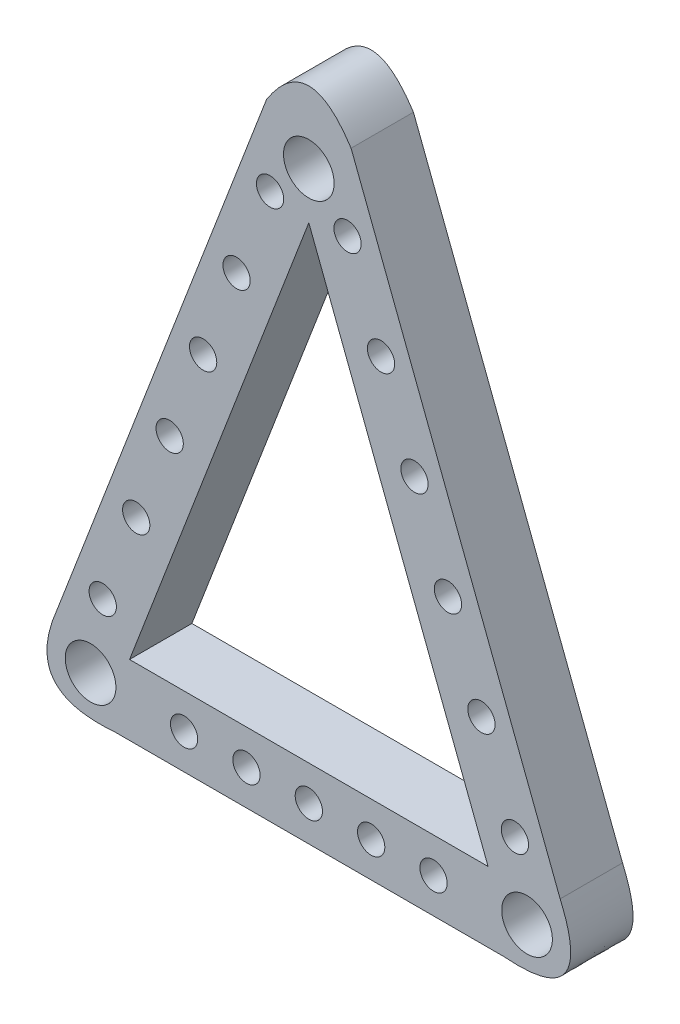
ISO-10303-21;
HEADER;
FILE_DESCRIPTION(('STEP AP214'),'2;1');
FILE_NAME('part.step','',(''),(''),'','','');
FILE_SCHEMA(('AUTOMOTIVE_DESIGN { 1 0 10303 214 1 1 1 1 }'));
ENDSEC;
DATA;
#1=APPLICATION_CONTEXT('core data for automotive mechanical design processes');
#2=APPLICATION_PROTOCOL_DEFINITION('international standard','automotive_design',2000,#1);
#3=PRODUCT_CONTEXT('',#1,'mechanical');
#4=PRODUCT('Part','Part','',(#3));
#5=PRODUCT_RELATED_PRODUCT_CATEGORY('part','',(#4));
#6=PRODUCT_DEFINITION_FORMATION('','',#4);
#7=PRODUCT_DEFINITION_CONTEXT('part definition',#1,'design');
#8=PRODUCT_DEFINITION('design','',#6,#7);
#9=PRODUCT_DEFINITION_SHAPE('','',#8);
#10=(LENGTH_UNIT() NAMED_UNIT(*) SI_UNIT(.MILLI.,.METRE.));
#11=(NAMED_UNIT(*) PLANE_ANGLE_UNIT() SI_UNIT($,.RADIAN.));
#12=(NAMED_UNIT(*) SI_UNIT($,.STERADIAN.) SOLID_ANGLE_UNIT());
#13=UNCERTAINTY_MEASURE_WITH_UNIT(LENGTH_MEASURE(1.E-05),#10,'distance_accuracy_value','');
#14=(GEOMETRIC_REPRESENTATION_CONTEXT(3) GLOBAL_UNCERTAINTY_ASSIGNED_CONTEXT((#13)) GLOBAL_UNIT_ASSIGNED_CONTEXT((#10,
#11,#12)) REPRESENTATION_CONTEXT('',''));
#15=CARTESIAN_POINT('',(0.,0.,0.));
#16=DIRECTION('',(0.,0.,1.));
#17=DIRECTION('',(1.,0.,0.));
#18=AXIS2_PLACEMENT_3D('',#15,#16,#17);
#19=CARTESIAN_POINT('',(0.,39.2060961403509,8.));
#20=DIRECTION('',(0.,0.,1.));
#21=DIRECTION('',(1.,0.,0.));
#22=AXIS2_PLACEMENT_3D('',#19,#20,#21);
#23=PLANE('',#22);
#24=CARTESIAN_POINT('',(9.26509593674221,13.7944872057478,8.));
#25=DIRECTION('',(0.,0.,1.));
#26=DIRECTION('',(-1.,0.,0.));
#27=AXIS2_PLACEMENT_3D('',#24,#25,#26);
#28=CIRCLE('',#27,1.75);
#29=CARTESIAN_POINT('',(7.5150959367422,13.7944872057478,8.));
#30=VERTEX_POINT('',#29);
#31=EDGE_CURVE('E361',#30,#30,#28,.T.);
#32=ORIENTED_EDGE('',*,*,#31,.F.);
#33=EDGE_LOOP('',(#32));
#34=FACE_BOUND('',#33,.T.);
#35=CARTESIAN_POINT('',(17.8526411081752,-8.61653838275659,8.));
#36=DIRECTION('',(0.,0.,1.));
#37=DIRECTION('',(-1.,0.,0.));
#38=AXIS2_PLACEMENT_3D('',#35,#36,#37);
#39=CIRCLE('',#38,1.75);
#40=CARTESIAN_POINT('',(16.1026411081751,-8.61653838275659,8.));
#41=VERTEX_POINT('',#40);
#42=EDGE_CURVE('E376',#41,#41,#39,.T.);
#43=ORIENTED_EDGE('',*,*,#42,.F.);
#44=EDGE_LOOP('',(#43));
#45=FACE_BOUND('',#44,.T.);
#46=CARTESIAN_POINT('',(26.4401862796081,-31.027563971261,8.));
#47=DIRECTION('',(0.,0.,1.));
#48=DIRECTION('',(-1.,0.,0.));
#49=AXIS2_PLACEMENT_3D('',#46,#47,#48);
#50=CIRCLE('',#49,1.75);
#51=CARTESIAN_POINT('',(24.6901862796081,-31.027563971261,8.));
#52=VERTEX_POINT('',#51);
#53=EDGE_CURVE('E390',#52,#52,#50,.T.);
#54=ORIENTED_EDGE('',*,*,#53,.F.);
#55=EDGE_LOOP('',(#54));
#56=FACE_BOUND('',#55,.T.);
#57=CARTESIAN_POINT('',(8.,-40.5233918128655,8.));
#58=DIRECTION('',(0.,0.,1.));
#59=DIRECTION('',(-1.,0.,0.));
#60=AXIS2_PLACEMENT_3D('',#57,#58,#59);
#61=CIRCLE('',#60,1.75);
#62=CARTESIAN_POINT('',(6.25,-40.5233918128655,8.));
#63=VERTEX_POINT('',#62);
#64=EDGE_CURVE('E404',#63,#63,#61,.T.);
#65=ORIENTED_EDGE('',*,*,#64,.F.);
#66=EDGE_LOOP('',(#65));
#67=FACE_BOUND('',#66,.T.);
#68=CARTESIAN_POINT('',(-8.,-40.5233918128655,8.));
#69=DIRECTION('',(0.,0.,1.));
#70=DIRECTION('',(1.,0.,0.));
#71=AXIS2_PLACEMENT_3D('',#68,#69,#70);
#72=CIRCLE('',#71,1.75);
#73=CARTESIAN_POINT('',(-6.25,-40.5233918128655,8.));
#74=VERTEX_POINT('',#73);
#75=EDGE_CURVE('E418',#74,#74,#72,.T.);
#76=ORIENTED_EDGE('',*,*,#75,.F.);
#77=EDGE_LOOP('',(#76));
#78=FACE_BOUND('',#77,.T.);
#79=CARTESIAN_POINT('',(-26.4401862796081,-31.027563971261,8.));
#80=DIRECTION('',(0.,0.,1.));
#81=DIRECTION('',(1.,0.,0.));
#82=AXIS2_PLACEMENT_3D('',#79,#80,#81);
#83=CIRCLE('',#82,1.75);
#84=CARTESIAN_POINT('',(-24.6901862796081,-31.027563971261,8.));
#85=VERTEX_POINT('',#84);
#86=EDGE_CURVE('E432',#85,#85,#83,.T.);
#87=ORIENTED_EDGE('',*,*,#86,.F.);
#88=EDGE_LOOP('',(#87));
#89=FACE_BOUND('',#88,.T.);
#90=CARTESIAN_POINT('',(-17.8526411081752,-8.61653838275659,8.));
#91=DIRECTION('',(0.,0.,1.));
#92=DIRECTION('',(1.,0.,0.));
#93=AXIS2_PLACEMENT_3D('',#90,#91,#92);
#94=CIRCLE('',#93,1.75);
#95=CARTESIAN_POINT('',(-16.1026411081751,-8.61653838275659,8.));
#96=VERTEX_POINT('',#95);
#97=EDGE_CURVE('E446',#96,#96,#94,.T.);
#98=ORIENTED_EDGE('',*,*,#97,.F.);
#99=EDGE_LOOP('',(#98));
#100=FACE_BOUND('',#99,.T.);
#101=CARTESIAN_POINT('',(-4.97132335102573,25.,8.));
#102=DIRECTION('',(0.,0.,1.));
#103=DIRECTION('',(1.,0.,0.));
#104=AXIS2_PLACEMENT_3D('',#101,#102,#103);
#105=CIRCLE('',#104,1.75);
#106=CARTESIAN_POINT('',(-3.22132335102573,25.,8.));
#107=VERTEX_POINT('',#106);
#108=EDGE_CURVE('E460',#107,#107,#105,.T.);
#109=ORIENTED_EDGE('',*,*,#108,.F.);
#110=EDGE_LOOP('',(#109));
#111=FACE_BOUND('',#110,.T.);
#112=DIRECTION('',(-0.357814382143039,-0.93379273285435,0.));
#113=VECTOR('',#112,1.);
#114=CARTESIAN_POINT('',(0.,24.,8.));
#115=LINE('',#114,#113);
#116=CARTESIAN_POINT('',(0.,24.,8.));
#117=VERTEX_POINT('',#116);
#118=CARTESIAN_POINT('',(-23.,-36.0233918128655,8.));
#119=VERTEX_POINT('',#118);
#120=EDGE_CURVE('E121',#117,#119,#115,.T.);
#121=ORIENTED_EDGE('',*,*,#120,.F.);
#122=DIRECTION('',(-0.35781438214304,0.93379273285435,0.));
#123=VECTOR('',#122,1.);
#124=CARTESIAN_POINT('',(23.,-36.0233918128655,8.));
#125=LINE('',#124,#123);
#126=CARTESIAN_POINT('',(23.,-36.0233918128655,8.));
#127=VERTEX_POINT('',#126);
#128=EDGE_CURVE('E112',#127,#117,#125,.T.);
#129=ORIENTED_EDGE('',*,*,#128,.F.);
#130=DIRECTION('',(1.,0.,0.));
#131=VECTOR('',#130,1.);
#132=CARTESIAN_POINT('',(-23.,-36.0233918128655,8.));
#133=LINE('',#132,#131);
#134=EDGE_CURVE('E132',#119,#127,#133,.T.);
#135=ORIENTED_EDGE('',*,*,#134,.F.);
#136=EDGE_LOOP('',(#121,#129,#135));
#137=FACE_BOUND('',#136,.T.);
#138=CARTESIAN_POINT('',(28.,-40.,8.));
#139=DIRECTION('',(0.,0.,1.));
#140=DIRECTION('',(1.,0.,0.));
#141=AXIS2_PLACEMENT_3D('',#138,#139,#140);
#142=CIRCLE('',#141,3.25);
#143=CARTESIAN_POINT('',(31.25,-40.,8.));
#144=VERTEX_POINT('',#143);
#145=EDGE_CURVE('E151',#144,#144,#142,.T.);
#146=ORIENTED_EDGE('',*,*,#145,.F.);
#147=EDGE_LOOP('',(#146));
#148=FACE_BOUND('',#147,.T.);
#149=CARTESIAN_POINT('',(0.,30.,8.));
#150=DIRECTION('',(0.,0.,1.));
#151=DIRECTION('',(1.,0.,0.));
#152=AXIS2_PLACEMENT_3D('',#149,#150,#151);
#153=CIRCLE('',#152,3.25);
#154=CARTESIAN_POINT('',(3.25,30.,8.));
#155=VERTEX_POINT('',#154);
#156=EDGE_CURVE('E167',#155,#155,#153,.T.);
#157=ORIENTED_EDGE('',*,*,#156,.F.);
#158=EDGE_LOOP('',(#157));
#159=FACE_BOUND('',#158,.T.);
#160=CARTESIAN_POINT('',(5.42308974813626,35.,8.));
#161=CARTESIAN_POINT('',(0.,43.4121922807018,8.));
#162=CARTESIAN_POINT('',(-5.42308974813626,35.,8.));
#163=B_SPLINE_CURVE_WITH_KNOTS('',2,(#160,#161,#162),.UNSPECIFIED.,.F.,.F.,(3,3),(0.,1.),.UNSPECIFIED.);
#164=CARTESIAN_POINT('',(5.42308974813626,35.,8.));
#165=VERTEX_POINT('',#164);
#166=CARTESIAN_POINT('',(-5.42308974813626,35.,8.));
#167=VERTEX_POINT('',#166);
#168=EDGE_CURVE('E174',#165,#167,#163,.T.);
#169=ORIENTED_EDGE('',*,*,#168,.T.);
#170=DIRECTION('',(-0.35781438214304,-0.93379273285435,0.));
#171=VECTOR('',#170,1.);
#172=CARTESIAN_POINT('',(-5.42308974813626,35.,8.));
#173=LINE('',#172,#171);
#174=CARTESIAN_POINT('',(-32.2459658198432,-35.,8.));
#175=VERTEX_POINT('',#174);
#176=EDGE_CURVE('E181',#167,#175,#173,.T.);
#177=ORIENTED_EDGE('',*,*,#176,.T.);
#178=CARTESIAN_POINT('',(-32.2459658198432,-35.,8.));
#179=CARTESIAN_POINT('',(-37.,-46.,8.));
#180=CARTESIAN_POINT('',(-25.,-45.0233918128655,8.));
#181=B_SPLINE_CURVE_WITH_KNOTS('',2,(#178,#179,#180),.UNSPECIFIED.,.F.,.F.,(3,3),(0.,1.),.UNSPECIFIED.);
#182=CARTESIAN_POINT('',(-25.,-45.0233918128655,8.));
#183=VERTEX_POINT('',#182);
#184=EDGE_CURVE('E188',#175,#183,#181,.T.);
#185=ORIENTED_EDGE('',*,*,#184,.T.);
#186=DIRECTION('',(1.,0.,0.));
#187=VECTOR('',#186,1.);
#188=CARTESIAN_POINT('',(-25.,-45.0233918128655,8.));
#189=LINE('',#188,#187);
#190=CARTESIAN_POINT('',(25.,-45.0233918128655,8.));
#191=VERTEX_POINT('',#190);
#192=EDGE_CURVE('E194',#183,#191,#189,.T.);
#193=ORIENTED_EDGE('',*,*,#192,.T.);
#194=CARTESIAN_POINT('',(25.,-45.0233918128655,8.));
#195=CARTESIAN_POINT('',(37.,-46.,8.));
#196=CARTESIAN_POINT('',(32.2459658198432,-35.,8.));
#197=B_SPLINE_CURVE_WITH_KNOTS('',2,(#194,#195,#196),.UNSPECIFIED.,.F.,.F.,(3,3),(0.,1.),.UNSPECIFIED.);
#198=CARTESIAN_POINT('',(32.2459658198432,-35.,8.));
#199=VERTEX_POINT('',#198);
#200=EDGE_CURVE('E234',#191,#199,#197,.T.);
#201=ORIENTED_EDGE('',*,*,#200,.T.);
#202=DIRECTION('',(-0.357814382143039,0.93379273285435,0.));
#203=VECTOR('',#202,1.);
#204=CARTESIAN_POINT('',(5.42308974813626,35.,8.));
#205=LINE('',#204,#203);
#206=EDGE_CURVE('E240',#199,#165,#205,.T.);
#207=ORIENTED_EDGE('',*,*,#206,.T.);
#208=EDGE_LOOP('',(#169,#177,#185,#193,#201,#207));
#209=FACE_BOUND('',#208,.T.);
#210=CARTESIAN_POINT('',(-28.,-40.,8.));
#211=DIRECTION('',(0.,0.,1.));
#212=DIRECTION('',(1.,0.,0.));
#213=AXIS2_PLACEMENT_3D('',#210,#211,#212);
#214=CIRCLE('',#213,3.25);
#215=CARTESIAN_POINT('',(-24.75,-40.,8.));
#216=VERTEX_POINT('',#215);
#217=EDGE_CURVE('E159',#216,#216,#214,.T.);
#218=ORIENTED_EDGE('',*,*,#217,.F.);
#219=EDGE_LOOP('',(#218));
#220=FACE_BOUND('',#219,.T.);
#221=CARTESIAN_POINT('',(-9.26509593674221,13.7944872057478,8.));
#222=DIRECTION('',(0.,0.,1.));
#223=DIRECTION('',(1.,0.,0.));
#224=AXIS2_PLACEMENT_3D('',#221,#222,#223);
#225=CIRCLE('',#224,1.75);
#226=CARTESIAN_POINT('',(-7.5150959367422,13.7944872057478,8.));
#227=VERTEX_POINT('',#226);
#228=EDGE_CURVE('E141',#227,#227,#225,.T.);
#229=ORIENTED_EDGE('',*,*,#228,.F.);
#230=EDGE_LOOP('',(#229));
#231=FACE_BOUND('',#230,.T.);
#232=CARTESIAN_POINT('',(-13.5588685224587,2.58897441149561,8.));
#233=DIRECTION('',(0.,0.,1.));
#234=DIRECTION('',(1.,0.,0.));
#235=AXIS2_PLACEMENT_3D('',#232,#233,#234);
#236=CIRCLE('',#235,1.75);
#237=CARTESIAN_POINT('',(-11.8088685224587,2.58897441149561,8.));
#238=VERTEX_POINT('',#237);
#239=EDGE_CURVE('E325',#238,#238,#236,.T.);
#240=ORIENTED_EDGE('',*,*,#239,.F.);
#241=EDGE_LOOP('',(#240));
#242=FACE_BOUND('',#241,.T.);
#243=CARTESIAN_POINT('',(-22.1464136938916,-19.8220511770088,8.));
#244=DIRECTION('',(0.,0.,1.));
#245=DIRECTION('',(1.,0.,0.));
#246=AXIS2_PLACEMENT_3D('',#243,#244,#245);
#247=CIRCLE('',#246,1.75);
#248=CARTESIAN_POINT('',(-20.3964136938916,-19.8220511770088,8.));
#249=VERTEX_POINT('',#248);
#250=EDGE_CURVE('E329',#249,#249,#247,.T.);
#251=ORIENTED_EDGE('',*,*,#250,.F.);
#252=EDGE_LOOP('',(#251));
#253=FACE_BOUND('',#252,.T.);
#254=CARTESIAN_POINT('',(-16.,-40.5233918128655,8.));
#255=DIRECTION('',(0.,0.,1.));
#256=DIRECTION('',(1.,0.,0.));
#257=AXIS2_PLACEMENT_3D('',#254,#255,#256);
#258=CIRCLE('',#257,1.75);
#259=CARTESIAN_POINT('',(-14.25,-40.5233918128655,8.));
#260=VERTEX_POINT('',#259);
#261=EDGE_CURVE('E333',#260,#260,#258,.T.);
#262=ORIENTED_EDGE('',*,*,#261,.F.);
#263=EDGE_LOOP('',(#262));
#264=FACE_BOUND('',#263,.T.);
#265=CARTESIAN_POINT('',(0.,-40.5233918128655,8.));
#266=DIRECTION('',(0.,0.,1.));
#267=DIRECTION('',(1.,0.,0.));
#268=AXIS2_PLACEMENT_3D('',#265,#266,#267);
#269=CIRCLE('',#268,1.75);
#270=CARTESIAN_POINT('',(1.75,-40.5233918128655,8.));
#271=VERTEX_POINT('',#270);
#272=EDGE_CURVE('E337',#271,#271,#269,.T.);
#273=ORIENTED_EDGE('',*,*,#272,.F.);
#274=EDGE_LOOP('',(#273));
#275=FACE_BOUND('',#274,.T.);
#276=CARTESIAN_POINT('',(16.,-40.5233918128655,8.));
#277=DIRECTION('',(0.,0.,1.));
#278=DIRECTION('',(-1.,0.,0.));
#279=AXIS2_PLACEMENT_3D('',#276,#277,#278);
#280=CIRCLE('',#279,1.75);
#281=CARTESIAN_POINT('',(14.25,-40.5233918128655,8.));
#282=VERTEX_POINT('',#281);
#283=EDGE_CURVE('E341',#282,#282,#280,.T.);
#284=ORIENTED_EDGE('',*,*,#283,.F.);
#285=EDGE_LOOP('',(#284));
#286=FACE_BOUND('',#285,.T.);
#287=CARTESIAN_POINT('',(22.1464136938916,-19.8220511770088,8.));
#288=DIRECTION('',(0.,0.,1.));
#289=DIRECTION('',(-1.,0.,0.));
#290=AXIS2_PLACEMENT_3D('',#287,#288,#289);
#291=CIRCLE('',#290,1.75);
#292=CARTESIAN_POINT('',(20.3964136938916,-19.8220511770088,8.));
#293=VERTEX_POINT('',#292);
#294=EDGE_CURVE('E345',#293,#293,#291,.T.);
#295=ORIENTED_EDGE('',*,*,#294,.F.);
#296=EDGE_LOOP('',(#295));
#297=FACE_BOUND('',#296,.T.);
#298=CARTESIAN_POINT('',(13.5588685224587,2.58897441149561,8.));
#299=DIRECTION('',(0.,0.,1.));
#300=DIRECTION('',(-1.,0.,0.));
#301=AXIS2_PLACEMENT_3D('',#298,#299,#300);
#302=CIRCLE('',#301,1.75);
#303=CARTESIAN_POINT('',(11.8088685224587,2.58897441149561,8.));
#304=VERTEX_POINT('',#303);
#305=EDGE_CURVE('E349',#304,#304,#302,.T.);
#306=ORIENTED_EDGE('',*,*,#305,.F.);
#307=EDGE_LOOP('',(#306));
#308=FACE_BOUND('',#307,.T.);
#309=CARTESIAN_POINT('',(4.97132335102573,25.,8.));
#310=DIRECTION('',(0.,0.,1.));
#311=DIRECTION('',(-1.,0.,0.));
#312=AXIS2_PLACEMENT_3D('',#309,#310,#311);
#313=CIRCLE('',#312,1.75);
#314=CARTESIAN_POINT('',(3.22132335102573,25.,8.));
#315=VERTEX_POINT('',#314);
#316=EDGE_CURVE('E352',#315,#315,#313,.T.);
#317=ORIENTED_EDGE('',*,*,#316,.F.);
#318=EDGE_LOOP('',(#317));
#319=FACE_BOUND('',#318,.T.);
#320=ADVANCED_FACE('F39',(#34,#45,#56,#67,#78,#89,#100,#111,#137,#148,#159,#209,#220,#231,#242,
#253,#264,#275,#286,#297,#308,#319),#23,.T.);
#321=CARTESIAN_POINT('',(0.,39.2060961403509,0.));
#322=DIRECTION('',(0.,0.,1.));
#323=DIRECTION('',(1.,0.,0.));
#324=AXIS2_PLACEMENT_3D('',#321,#322,#323);
#325=PLANE('',#324);
#326=CARTESIAN_POINT('',(28.,-40.,0.));
#327=DIRECTION('',(0.,0.,1.));
#328=DIRECTION('',(1.,0.,0.));
#329=AXIS2_PLACEMENT_3D('',#326,#327,#328);
#330=CIRCLE('',#329,3.25);
#331=CARTESIAN_POINT('',(31.25,-40.,0.));
#332=VERTEX_POINT('',#331);
#333=EDGE_CURVE('E129',#332,#332,#330,.T.);
#334=ORIENTED_EDGE('',*,*,#333,.T.);
#335=EDGE_LOOP('',(#334));
#336=FACE_BOUND('',#335,.T.);
#337=CARTESIAN_POINT('',(-28.,-40.,0.));
#338=DIRECTION('',(0.,0.,1.));
#339=DIRECTION('',(1.,0.,0.));
#340=AXIS2_PLACEMENT_3D('',#337,#338,#339);
#341=CIRCLE('',#340,3.25);
#342=CARTESIAN_POINT('',(-24.75,-40.,0.));
#343=VERTEX_POINT('',#342);
#344=EDGE_CURVE('E155',#343,#343,#341,.T.);
#345=ORIENTED_EDGE('',*,*,#344,.T.);
#346=EDGE_LOOP('',(#345));
#347=FACE_BOUND('',#346,.T.);
#348=CARTESIAN_POINT('',(0.,30.,0.));
#349=DIRECTION('',(0.,0.,1.));
#350=DIRECTION('',(1.,0.,0.));
#351=AXIS2_PLACEMENT_3D('',#348,#349,#350);
#352=CIRCLE('',#351,3.25);
#353=CARTESIAN_POINT('',(3.25,30.,0.));
#354=VERTEX_POINT('',#353);
#355=EDGE_CURVE('E163',#354,#354,#352,.T.);
#356=ORIENTED_EDGE('',*,*,#355,.T.);
#357=EDGE_LOOP('',(#356));
#358=FACE_BOUND('',#357,.T.);
#359=CARTESIAN_POINT('',(5.42308974813626,35.,0.));
#360=CARTESIAN_POINT('',(0.,43.4121922807018,0.));
#361=CARTESIAN_POINT('',(-5.42308974813626,35.,0.));
#362=B_SPLINE_CURVE_WITH_KNOTS('',2,(#359,#360,#361),.UNSPECIFIED.,.F.,.F.,(3,3),(0.,1.),.UNSPECIFIED.);
#363=CARTESIAN_POINT('',(5.42308974813626,35.,0.));
#364=VERTEX_POINT('',#363);
#365=CARTESIAN_POINT('',(-5.42308974813626,35.,0.));
#366=VERTEX_POINT('',#365);
#367=EDGE_CURVE('E171',#364,#366,#362,.T.);
#368=ORIENTED_EDGE('',*,*,#367,.F.);
#369=DIRECTION('',(-0.357814382143039,0.93379273285435,0.));
#370=VECTOR('',#369,1.);
#371=CARTESIAN_POINT('',(5.42308974813626,35.,0.));
#372=LINE('',#371,#370);
#373=CARTESIAN_POINT('',(32.2459658198432,-35.,0.));
#374=VERTEX_POINT('',#373);
#375=EDGE_CURVE('E182',#374,#364,#372,.T.);
#376=ORIENTED_EDGE('',*,*,#375,.F.);
#377=CARTESIAN_POINT('',(25.,-45.0233918128655,0.));
#378=CARTESIAN_POINT('',(37.,-46.,0.));
#379=CARTESIAN_POINT('',(32.2459658198432,-35.,0.));
#380=B_SPLINE_CURVE_WITH_KNOTS('',2,(#377,#378,#379),.UNSPECIFIED.,.F.,.F.,(3,3),(0.,1.),.UNSPECIFIED.);
#381=CARTESIAN_POINT('',(25.,-45.0233918128655,0.));
#382=VERTEX_POINT('',#381);
#383=EDGE_CURVE('E269',#382,#374,#380,.T.);
#384=ORIENTED_EDGE('',*,*,#383,.F.);
#385=DIRECTION('',(1.,0.,0.));
#386=VECTOR('',#385,1.);
#387=CARTESIAN_POINT('',(-25.,-45.0233918128655,0.));
#388=LINE('',#387,#386);
#389=CARTESIAN_POINT('',(-25.,-45.0233918128655,0.));
#390=VERTEX_POINT('',#389);
#391=EDGE_CURVE('E263',#390,#382,#388,.T.);
#392=ORIENTED_EDGE('',*,*,#391,.F.);
#393=CARTESIAN_POINT('',(-32.2459658198432,-35.,0.));
#394=CARTESIAN_POINT('',(-37.,-46.,0.));
#395=CARTESIAN_POINT('',(-25.,-45.0233918128655,0.));
#396=B_SPLINE_CURVE_WITH_KNOTS('',2,(#393,#394,#395),.UNSPECIFIED.,.F.,.F.,(3,3),(0.,1.),.UNSPECIFIED.);
#397=CARTESIAN_POINT('',(-32.2459658198432,-35.,0.));
#398=VERTEX_POINT('',#397);
#399=EDGE_CURVE('E258',#398,#390,#396,.T.);
#400=ORIENTED_EDGE('',*,*,#399,.F.);
#401=DIRECTION('',(-0.35781438214304,-0.93379273285435,0.));
#402=VECTOR('',#401,1.);
#403=CARTESIAN_POINT('',(-5.42308974813626,35.,0.));
#404=LINE('',#403,#402);
#405=EDGE_CURVE('E252',#366,#398,#404,.T.);
#406=ORIENTED_EDGE('',*,*,#405,.F.);
#407=EDGE_LOOP('',(#368,#376,#384,#392,#400,#406));
#408=FACE_BOUND('',#407,.T.);
#409=DIRECTION('',(-0.35781438214304,0.93379273285435,0.));
#410=VECTOR('',#409,1.);
#411=CARTESIAN_POINT('',(23.,-36.0233918128655,0.));
#412=LINE('',#411,#410);
#413=CARTESIAN_POINT('',(23.,-36.0233918128655,0.));
#414=VERTEX_POINT('',#413);
#415=CARTESIAN_POINT('',(0.,24.,0.));
#416=VERTEX_POINT('',#415);
#417=EDGE_CURVE('E64',#414,#416,#412,.T.);
#418=ORIENTED_EDGE('',*,*,#417,.T.);
#419=DIRECTION('',(-0.357814382143039,-0.93379273285435,0.));
#420=VECTOR('',#419,1.);
#421=CARTESIAN_POINT('',(0.,24.,0.));
#422=LINE('',#421,#420);
#423=CARTESIAN_POINT('',(-23.,-36.0233918128655,0.));
#424=VERTEX_POINT('',#423);
#425=EDGE_CURVE('E127',#416,#424,#422,.T.);
#426=ORIENTED_EDGE('',*,*,#425,.T.);
#427=DIRECTION('',(1.,0.,0.));
#428=VECTOR('',#427,1.);
#429=CARTESIAN_POINT('',(-23.,-36.0233918128655,0.));
#430=LINE('',#429,#428);
#431=EDGE_CURVE('E122',#424,#414,#430,.T.);
#432=ORIENTED_EDGE('',*,*,#431,.T.);
#433=EDGE_LOOP('',(#418,#426,#432));
#434=FACE_BOUND('',#433,.T.);
#435=CARTESIAN_POINT('',(-9.26509593674221,13.7944872057478,0.));
#436=DIRECTION('',(0.,0.,1.));
#437=DIRECTION('',(1.,0.,0.));
#438=AXIS2_PLACEMENT_3D('',#435,#436,#437);
#439=CIRCLE('',#438,1.75);
#440=CARTESIAN_POINT('',(-7.5150959367422,13.7944872057478,0.));
#441=VERTEX_POINT('',#440);
#442=EDGE_CURVE('E464',#441,#441,#439,.T.);
#443=ORIENTED_EDGE('',*,*,#442,.T.);
#444=EDGE_LOOP('',(#443));
#445=FACE_BOUND('',#444,.T.);
#446=CARTESIAN_POINT('',(-4.97132335102573,25.,0.));
#447=DIRECTION('',(0.,0.,1.));
#448=DIRECTION('',(1.,0.,0.));
#449=AXIS2_PLACEMENT_3D('',#446,#447,#448);
#450=CIRCLE('',#449,1.75);
#451=CARTESIAN_POINT('',(-3.22132335102573,25.,0.));
#452=VERTEX_POINT('',#451);
#453=EDGE_CURVE('E456',#452,#452,#450,.T.);
#454=ORIENTED_EDGE('',*,*,#453,.T.);
#455=EDGE_LOOP('',(#454));
#456=FACE_BOUND('',#455,.T.);
#457=CARTESIAN_POINT('',(-13.5588685224587,2.58897441149561,0.));
#458=DIRECTION('',(0.,0.,1.));
#459=DIRECTION('',(1.,0.,0.));
#460=AXIS2_PLACEMENT_3D('',#457,#458,#459);
#461=CIRCLE('',#460,1.75);
#462=CARTESIAN_POINT('',(-11.8088685224587,2.58897441149561,0.));
#463=VERTEX_POINT('',#462);
#464=EDGE_CURVE('E450',#463,#463,#461,.T.);
#465=ORIENTED_EDGE('',*,*,#464,.T.);
#466=EDGE_LOOP('',(#465));
#467=FACE_BOUND('',#466,.T.);
#468=CARTESIAN_POINT('',(-17.8526411081752,-8.61653838275659,0.));
#469=DIRECTION('',(0.,0.,1.));
#470=DIRECTION('',(1.,0.,0.));
#471=AXIS2_PLACEMENT_3D('',#468,#469,#470);
#472=CIRCLE('',#471,1.75);
#473=CARTESIAN_POINT('',(-16.1026411081751,-8.61653838275659,0.));
#474=VERTEX_POINT('',#473);
#475=EDGE_CURVE('E442',#474,#474,#472,.T.);
#476=ORIENTED_EDGE('',*,*,#475,.T.);
#477=EDGE_LOOP('',(#476));
#478=FACE_BOUND('',#477,.T.);
#479=CARTESIAN_POINT('',(-22.1464136938916,-19.8220511770088,0.));
#480=DIRECTION('',(0.,0.,1.));
#481=DIRECTION('',(1.,0.,0.));
#482=AXIS2_PLACEMENT_3D('',#479,#480,#481);
#483=CIRCLE('',#482,1.75);
#484=CARTESIAN_POINT('',(-20.3964136938916,-19.8220511770088,0.));
#485=VERTEX_POINT('',#484);
#486=EDGE_CURVE('E436',#485,#485,#483,.T.);
#487=ORIENTED_EDGE('',*,*,#486,.T.);
#488=EDGE_LOOP('',(#487));
#489=FACE_BOUND('',#488,.T.);
#490=CARTESIAN_POINT('',(-26.4401862796081,-31.027563971261,0.));
#491=DIRECTION('',(0.,0.,1.));
#492=DIRECTION('',(1.,0.,0.));
#493=AXIS2_PLACEMENT_3D('',#490,#491,#492);
#494=CIRCLE('',#493,1.75);
#495=CARTESIAN_POINT('',(-24.6901862796081,-31.027563971261,0.));
#496=VERTEX_POINT('',#495);
#497=EDGE_CURVE('E428',#496,#496,#494,.T.);
#498=ORIENTED_EDGE('',*,*,#497,.T.);
#499=EDGE_LOOP('',(#498));
#500=FACE_BOUND('',#499,.T.);
#501=CARTESIAN_POINT('',(-16.,-40.5233918128655,0.));
#502=DIRECTION('',(0.,0.,1.));
#503=DIRECTION('',(1.,0.,0.));
#504=AXIS2_PLACEMENT_3D('',#501,#502,#503);
#505=CIRCLE('',#504,1.75);
#506=CARTESIAN_POINT('',(-14.25,-40.5233918128655,0.));
#507=VERTEX_POINT('',#506);
#508=EDGE_CURVE('E422',#507,#507,#505,.T.);
#509=ORIENTED_EDGE('',*,*,#508,.T.);
#510=EDGE_LOOP('',(#509));
#511=FACE_BOUND('',#510,.T.);
#512=CARTESIAN_POINT('',(-8.,-40.5233918128655,0.));
#513=DIRECTION('',(0.,0.,1.));
#514=DIRECTION('',(1.,0.,0.));
#515=AXIS2_PLACEMENT_3D('',#512,#513,#514);
#516=CIRCLE('',#515,1.75);
#517=CARTESIAN_POINT('',(-6.25,-40.5233918128655,0.));
#518=VERTEX_POINT('',#517);
#519=EDGE_CURVE('E414',#518,#518,#516,.T.);
#520=ORIENTED_EDGE('',*,*,#519,.T.);
#521=EDGE_LOOP('',(#520));
#522=FACE_BOUND('',#521,.T.);
#523=CARTESIAN_POINT('',(0.,-40.5233918128655,0.));
#524=DIRECTION('',(0.,0.,1.));
#525=DIRECTION('',(1.,0.,0.));
#526=AXIS2_PLACEMENT_3D('',#523,#524,#525);
#527=CIRCLE('',#526,1.75);
#528=CARTESIAN_POINT('',(1.75,-40.5233918128655,0.));
#529=VERTEX_POINT('',#528);
#530=EDGE_CURVE('E408',#529,#529,#527,.T.);
#531=ORIENTED_EDGE('',*,*,#530,.T.);
#532=EDGE_LOOP('',(#531));
#533=FACE_BOUND('',#532,.T.);
#534=CARTESIAN_POINT('',(8.,-40.5233918128655,0.));
#535=DIRECTION('',(0.,0.,1.));
#536=DIRECTION('',(-1.,0.,0.));
#537=AXIS2_PLACEMENT_3D('',#534,#535,#536);
#538=CIRCLE('',#537,1.75);
#539=CARTESIAN_POINT('',(6.25,-40.5233918128655,0.));
#540=VERTEX_POINT('',#539);
#541=EDGE_CURVE('E400',#540,#540,#538,.T.);
#542=ORIENTED_EDGE('',*,*,#541,.T.);
#543=EDGE_LOOP('',(#542));
#544=FACE_BOUND('',#543,.T.);
#545=CARTESIAN_POINT('',(16.,-40.5233918128655,0.));
#546=DIRECTION('',(0.,0.,1.));
#547=DIRECTION('',(-1.,0.,0.));
#548=AXIS2_PLACEMENT_3D('',#545,#546,#547);
#549=CIRCLE('',#548,1.75);
#550=CARTESIAN_POINT('',(14.25,-40.5233918128655,0.));
#551=VERTEX_POINT('',#550);
#552=EDGE_CURVE('E394',#551,#551,#549,.T.);
#553=ORIENTED_EDGE('',*,*,#552,.T.);
#554=EDGE_LOOP('',(#553));
#555=FACE_BOUND('',#554,.T.);
#556=CARTESIAN_POINT('',(26.4401862796081,-31.027563971261,0.));
#557=DIRECTION('',(0.,0.,1.));
#558=DIRECTION('',(-1.,0.,0.));
#559=AXIS2_PLACEMENT_3D('',#556,#557,#558);
#560=CIRCLE('',#559,1.75);
#561=CARTESIAN_POINT('',(24.6901862796081,-31.027563971261,0.));
#562=VERTEX_POINT('',#561);
#563=EDGE_CURVE('E386',#562,#562,#560,.T.);
#564=ORIENTED_EDGE('',*,*,#563,.T.);
#565=EDGE_LOOP('',(#564));
#566=FACE_BOUND('',#565,.T.);
#567=CARTESIAN_POINT('',(22.1464136938916,-19.8220511770088,0.));
#568=DIRECTION('',(0.,0.,1.));
#569=DIRECTION('',(-1.,0.,0.));
#570=AXIS2_PLACEMENT_3D('',#567,#568,#569);
#571=CIRCLE('',#570,1.75);
#572=CARTESIAN_POINT('',(20.3964136938916,-19.8220511770088,0.));
#573=VERTEX_POINT('',#572);
#574=EDGE_CURVE('E380',#573,#573,#571,.T.);
#575=ORIENTED_EDGE('',*,*,#574,.T.);
#576=EDGE_LOOP('',(#575));
#577=FACE_BOUND('',#576,.T.);
#578=CARTESIAN_POINT('',(17.8526411081752,-8.61653838275659,0.));
#579=DIRECTION('',(0.,0.,1.));
#580=DIRECTION('',(-1.,0.,0.));
#581=AXIS2_PLACEMENT_3D('',#578,#579,#580);
#582=CIRCLE('',#581,1.75);
#583=CARTESIAN_POINT('',(16.1026411081751,-8.61653838275659,0.));
#584=VERTEX_POINT('',#583);
#585=EDGE_CURVE('E372',#584,#584,#582,.T.);
#586=ORIENTED_EDGE('',*,*,#585,.T.);
#587=EDGE_LOOP('',(#586));
#588=FACE_BOUND('',#587,.T.);
#589=CARTESIAN_POINT('',(13.5588685224587,2.58897441149561,0.));
#590=DIRECTION('',(0.,0.,1.));
#591=DIRECTION('',(-1.,0.,0.));
#592=AXIS2_PLACEMENT_3D('',#589,#590,#591);
#593=CIRCLE('',#592,1.75);
#594=CARTESIAN_POINT('',(11.8088685224587,2.58897441149561,0.));
#595=VERTEX_POINT('',#594);
#596=EDGE_CURVE('E368',#595,#595,#593,.T.);
#597=ORIENTED_EDGE('',*,*,#596,.T.);
#598=EDGE_LOOP('',(#597));
#599=FACE_BOUND('',#598,.T.);
#600=CARTESIAN_POINT('',(9.26509593674221,13.7944872057478,0.));
#601=DIRECTION('',(0.,0.,1.));
#602=DIRECTION('',(-1.,0.,0.));
#603=AXIS2_PLACEMENT_3D('',#600,#601,#602);
#604=CIRCLE('',#603,1.75);
#605=CARTESIAN_POINT('',(7.5150959367422,13.7944872057478,0.));
#606=VERTEX_POINT('',#605);
#607=EDGE_CURVE('E355',#606,#606,#604,.T.);
#608=ORIENTED_EDGE('',*,*,#607,.T.);
#609=EDGE_LOOP('',(#608));
#610=FACE_BOUND('',#609,.T.);
#611=CARTESIAN_POINT('',(4.97132335102573,25.,0.));
#612=DIRECTION('',(0.,0.,1.));
#613=DIRECTION('',(-1.,0.,0.));
#614=AXIS2_PLACEMENT_3D('',#611,#612,#613);
#615=CIRCLE('',#614,1.75);
#616=CARTESIAN_POINT('',(3.22132335102573,25.,0.));
#617=VERTEX_POINT('',#616);
#618=EDGE_CURVE('E356',#617,#617,#615,.T.);
#619=ORIENTED_EDGE('',*,*,#618,.T.);
#620=EDGE_LOOP('',(#619));
#621=FACE_BOUND('',#620,.T.);
#622=ADVANCED_FACE('F212',(#336,#347,#358,#408,#434,#445,#456,#467,#478,#489,#500,#511,#522,
#533,#544,#555,#566,#577,#588,#599,#610,#621),#325,.F.);
#623=DIRECTION('',(0.,0.,-1.));
#624=VECTOR('',#623,1.);
#625=SURFACE_OF_LINEAR_EXTRUSION('',#163,#624);
#626=ORIENTED_EDGE('',*,*,#367,.T.);
#627=DIRECTION('',(0.,0.,-1.));
#628=VECTOR('',#627,1.);
#629=CARTESIAN_POINT('',(-5.42308974813626,35.,8.));
#630=LINE('',#629,#628);
#631=EDGE_CURVE('E11',#167,#366,#630,.T.);
#632=ORIENTED_EDGE('',*,*,#631,.F.);
#633=ORIENTED_EDGE('',*,*,#168,.F.);
#634=DIRECTION('',(0.,0.,-1.));
#635=VECTOR('',#634,1.);
#636=CARTESIAN_POINT('',(5.42308974813626,35.,8.));
#637=LINE('',#636,#635);
#638=EDGE_CURVE('E246',#165,#364,#637,.T.);
#639=ORIENTED_EDGE('',*,*,#638,.T.);
#640=EDGE_LOOP('',(#626,#632,#633,#639));
#641=FACE_BOUND('',#640,.T.);
#642=ADVANCED_FACE('F41',(#641),#625,.F.);
#643=CARTESIAN_POINT('',(-5.42308974813626,35.,8.));
#644=DIRECTION('',(0.93379273285435,-0.35781438214304,0.));
#645=DIRECTION('',(0.35781438214304,0.93379273285435,0.));
#646=AXIS2_PLACEMENT_3D('',#643,#644,#645);
#647=PLANE('',#646);
#648=ORIENTED_EDGE('',*,*,#405,.T.);
#649=DIRECTION('',(0.,0.,-1.));
#650=VECTOR('',#649,1.);
#651=CARTESIAN_POINT('',(-32.2459658198432,-35.,8.));
#652=LINE('',#651,#650);
#653=EDGE_CURVE('E49',#175,#398,#652,.T.);
#654=ORIENTED_EDGE('',*,*,#653,.F.);
#655=ORIENTED_EDGE('',*,*,#176,.F.);
#656=ORIENTED_EDGE('',*,*,#631,.T.);
#657=EDGE_LOOP('',(#648,#654,#655,#656));
#658=FACE_BOUND('',#657,.T.);
#659=ADVANCED_FACE('F204',(#658),#647,.F.);
#660=DIRECTION('',(0.,0.,-1.));
#661=VECTOR('',#660,1.);
#662=SURFACE_OF_LINEAR_EXTRUSION('',#181,#661);
#663=ORIENTED_EDGE('',*,*,#399,.T.);
#664=DIRECTION('',(0.,0.,-1.));
#665=VECTOR('',#664,1.);
#666=CARTESIAN_POINT('',(-25.,-45.0233918128655,8.));
#667=LINE('',#666,#665);
#668=EDGE_CURVE('E290',#183,#390,#667,.T.);
#669=ORIENTED_EDGE('',*,*,#668,.F.);
#670=ORIENTED_EDGE('',*,*,#184,.F.);
#671=ORIENTED_EDGE('',*,*,#653,.T.);
#672=EDGE_LOOP('',(#663,#669,#670,#671));
#673=FACE_BOUND('',#672,.T.);
#674=ADVANCED_FACE('F200',(#673),#662,.F.);
#675=CARTESIAN_POINT('',(-25.,-45.0233918128655,8.));
#676=DIRECTION('',(0.,1.,0.));
#677=DIRECTION('',(0.,0.,1.));
#678=AXIS2_PLACEMENT_3D('',#675,#676,#677);
#679=PLANE('',#678);
#680=ORIENTED_EDGE('',*,*,#391,.T.);
#681=DIRECTION('',(0.,0.,-1.));
#682=VECTOR('',#681,1.);
#683=CARTESIAN_POINT('',(25.,-45.0233918128655,8.));
#684=LINE('',#683,#682);
#685=EDGE_CURVE('E286',#191,#382,#684,.T.);
#686=ORIENTED_EDGE('',*,*,#685,.F.);
#687=ORIENTED_EDGE('',*,*,#192,.F.);
#688=ORIENTED_EDGE('',*,*,#668,.T.);
#689=EDGE_LOOP('',(#680,#686,#687,#688));
#690=FACE_BOUND('',#689,.T.);
#691=ADVANCED_FACE('F203',(#690),#679,.F.);
#692=DIRECTION('',(0.,0.,-1.));
#693=VECTOR('',#692,1.);
#694=SURFACE_OF_LINEAR_EXTRUSION('',#197,#693);
#695=ORIENTED_EDGE('',*,*,#383,.T.);
#696=DIRECTION('',(0.,0.,-1.));
#697=VECTOR('',#696,1.);
#698=CARTESIAN_POINT('',(32.2459658198432,-35.,8.));
#699=LINE('',#698,#697);
#700=EDGE_CURVE('E282',#199,#374,#699,.T.);
#701=ORIENTED_EDGE('',*,*,#700,.F.);
#702=ORIENTED_EDGE('',*,*,#200,.F.);
#703=ORIENTED_EDGE('',*,*,#685,.T.);
#704=EDGE_LOOP('',(#695,#701,#702,#703));
#705=FACE_BOUND('',#704,.T.);
#706=ADVANCED_FACE('F230',(#705),#694,.F.);
#707=CARTESIAN_POINT('',(5.42308974813626,35.,8.));
#708=DIRECTION('',(-0.93379273285435,-0.357814382143039,0.));
#709=DIRECTION('',(0.357814382143039,-0.93379273285435,0.));
#710=AXIS2_PLACEMENT_3D('',#707,#708,#709);
#711=PLANE('',#710);
#712=ORIENTED_EDGE('',*,*,#375,.T.);
#713=ORIENTED_EDGE('',*,*,#638,.F.);
#714=ORIENTED_EDGE('',*,*,#206,.F.);
#715=ORIENTED_EDGE('',*,*,#700,.T.);
#716=EDGE_LOOP('',(#712,#713,#714,#715));
#717=FACE_BOUND('',#716,.T.);
#718=ADVANCED_FACE('F228',(#717),#711,.F.);
#719=CARTESIAN_POINT('',(0.,30.,8.));
#720=DIRECTION('',(0.,0.,-1.));
#721=DIRECTION('',(-1.,0.,0.));
#722=AXIS2_PLACEMENT_3D('',#719,#720,#721);
#723=CYLINDRICAL_SURFACE('',#722,3.25);
#724=ORIENTED_EDGE('',*,*,#156,.T.);
#725=EDGE_LOOP('',(#724));
#726=FACE_BOUND('',#725,.T.);
#727=ORIENTED_EDGE('',*,*,#355,.F.);
#728=EDGE_LOOP('',(#727));
#729=FACE_BOUND('',#728,.T.);
#730=ADVANCED_FACE('F225',(#726,#729),#723,.F.);
#731=CARTESIAN_POINT('',(-28.,-40.,8.));
#732=DIRECTION('',(0.,0.,-1.));
#733=DIRECTION('',(-1.,0.,0.));
#734=AXIS2_PLACEMENT_3D('',#731,#732,#733);
#735=CYLINDRICAL_SURFACE('',#734,3.25);
#736=ORIENTED_EDGE('',*,*,#217,.T.);
#737=EDGE_LOOP('',(#736));
#738=FACE_BOUND('',#737,.T.);
#739=ORIENTED_EDGE('',*,*,#344,.F.);
#740=EDGE_LOOP('',(#739));
#741=FACE_BOUND('',#740,.T.);
#742=ADVANCED_FACE('F497',(#738,#741),#735,.F.);
#743=CARTESIAN_POINT('',(28.,-40.,8.));
#744=DIRECTION('',(0.,0.,-1.));
#745=DIRECTION('',(-1.,0.,0.));
#746=AXIS2_PLACEMENT_3D('',#743,#744,#745);
#747=CYLINDRICAL_SURFACE('',#746,3.25);
#748=ORIENTED_EDGE('',*,*,#145,.T.);
#749=EDGE_LOOP('',(#748));
#750=FACE_BOUND('',#749,.T.);
#751=ORIENTED_EDGE('',*,*,#333,.F.);
#752=EDGE_LOOP('',(#751));
#753=FACE_BOUND('',#752,.T.);
#754=ADVANCED_FACE('F495',(#750,#753),#747,.F.);
#755=CARTESIAN_POINT('',(23.,-36.0233918128655,8.));
#756=DIRECTION('',(-0.93379273285435,-0.35781438214304,0.));
#757=DIRECTION('',(0.35781438214304,-0.93379273285435,0.));
#758=AXIS2_PLACEMENT_3D('',#755,#756,#757);
#759=PLANE('',#758);
#760=ORIENTED_EDGE('',*,*,#417,.F.);
#761=DIRECTION('',(0.,0.,-1.));
#762=VECTOR('',#761,1.);
#763=CARTESIAN_POINT('',(23.,-36.0233918128655,8.));
#764=LINE('',#763,#762);
#765=EDGE_CURVE('E116',#127,#414,#764,.T.);
#766=ORIENTED_EDGE('',*,*,#765,.F.);
#767=ORIENTED_EDGE('',*,*,#128,.T.);
#768=DIRECTION('',(0.,0.,-1.));
#769=VECTOR('',#768,1.);
#770=CARTESIAN_POINT('',(0.,24.,8.));
#771=LINE('',#770,#769);
#772=EDGE_CURVE('E115',#117,#416,#771,.T.);
#773=ORIENTED_EDGE('',*,*,#772,.T.);
#774=EDGE_LOOP('',(#760,#766,#767,#773));
#775=FACE_BOUND('',#774,.T.);
#776=ADVANCED_FACE('F114',(#775),#759,.T.);
#777=CARTESIAN_POINT('',(0.,24.,8.));
#778=DIRECTION('',(0.93379273285435,-0.357814382143039,0.));
#779=DIRECTION('',(0.357814382143039,0.93379273285435,0.));
#780=AXIS2_PLACEMENT_3D('',#777,#778,#779);
#781=PLANE('',#780);
#782=ORIENTED_EDGE('',*,*,#425,.F.);
#783=ORIENTED_EDGE('',*,*,#772,.F.);
#784=ORIENTED_EDGE('',*,*,#120,.T.);
#785=DIRECTION('',(0.,0.,-1.));
#786=VECTOR('',#785,1.);
#787=CARTESIAN_POINT('',(-23.,-36.0233918128655,8.));
#788=LINE('',#787,#786);
#789=EDGE_CURVE('E56',#119,#424,#788,.T.);
#790=ORIENTED_EDGE('',*,*,#789,.T.);
#791=EDGE_LOOP('',(#782,#783,#784,#790));
#792=FACE_BOUND('',#791,.T.);
#793=ADVANCED_FACE('F125',(#792),#781,.T.);
#794=CARTESIAN_POINT('',(-23.,-36.0233918128655,8.));
#795=DIRECTION('',(0.,1.,0.));
#796=DIRECTION('',(0.,0.,1.));
#797=AXIS2_PLACEMENT_3D('',#794,#795,#796);
#798=PLANE('',#797);
#799=ORIENTED_EDGE('',*,*,#431,.F.);
#800=ORIENTED_EDGE('',*,*,#789,.F.);
#801=ORIENTED_EDGE('',*,*,#134,.T.);
#802=ORIENTED_EDGE('',*,*,#765,.T.);
#803=EDGE_LOOP('',(#799,#800,#801,#802));
#804=FACE_BOUND('',#803,.T.);
#805=ADVANCED_FACE('F478',(#804),#798,.T.);
#806=CARTESIAN_POINT('',(-9.26509593674221,13.7944872057478,8.));
#807=DIRECTION('',(0.,0.,-1.));
#808=DIRECTION('',(-1.,0.,0.));
#809=AXIS2_PLACEMENT_3D('',#806,#807,#808);
#810=CYLINDRICAL_SURFACE('',#809,1.75);
#811=ORIENTED_EDGE('',*,*,#228,.T.);
#812=EDGE_LOOP('',(#811));
#813=FACE_BOUND('',#812,.T.);
#814=ORIENTED_EDGE('',*,*,#442,.F.);
#815=EDGE_LOOP('',(#814));
#816=FACE_BOUND('',#815,.T.);
#817=ADVANCED_FACE('F475',(#813,#816),#810,.F.);
#818=CARTESIAN_POINT('',(-4.97132335102573,25.,8.));
#819=DIRECTION('',(0.,0.,-1.));
#820=DIRECTION('',(-1.,0.,0.));
#821=AXIS2_PLACEMENT_3D('',#818,#819,#820);
#822=CYLINDRICAL_SURFACE('',#821,1.75);
#823=ORIENTED_EDGE('',*,*,#108,.T.);
#824=EDGE_LOOP('',(#823));
#825=FACE_BOUND('',#824,.T.);
#826=ORIENTED_EDGE('',*,*,#453,.F.);
#827=EDGE_LOOP('',(#826));
#828=FACE_BOUND('',#827,.T.);
#829=ADVANCED_FACE('F477',(#825,#828),#822,.F.);
#830=CARTESIAN_POINT('',(-13.5588685224587,2.58897441149561,8.));
#831=DIRECTION('',(0.,0.,-1.));
#832=DIRECTION('',(-1.,0.,0.));
#833=AXIS2_PLACEMENT_3D('',#830,#831,#832);
#834=CYLINDRICAL_SURFACE('',#833,1.75);
#835=ORIENTED_EDGE('',*,*,#239,.T.);
#836=EDGE_LOOP('',(#835));
#837=FACE_BOUND('',#836,.T.);
#838=ORIENTED_EDGE('',*,*,#464,.F.);
#839=EDGE_LOOP('',(#838));
#840=FACE_BOUND('',#839,.T.);
#841=ADVANCED_FACE('F485',(#837,#840),#834,.F.);
#842=CARTESIAN_POINT('',(-17.8526411081752,-8.61653838275659,8.));
#843=DIRECTION('',(0.,0.,-1.));
#844=DIRECTION('',(-1.,0.,0.));
#845=AXIS2_PLACEMENT_3D('',#842,#843,#844);
#846=CYLINDRICAL_SURFACE('',#845,1.75);
#847=ORIENTED_EDGE('',*,*,#97,.T.);
#848=EDGE_LOOP('',(#847));
#849=FACE_BOUND('',#848,.T.);
#850=ORIENTED_EDGE('',*,*,#475,.F.);
#851=EDGE_LOOP('',(#850));
#852=FACE_BOUND('',#851,.T.);
#853=ADVANCED_FACE('F603',(#849,#852),#846,.F.);
#854=CARTESIAN_POINT('',(-22.1464136938916,-19.8220511770088,8.));
#855=DIRECTION('',(0.,0.,-1.));
#856=DIRECTION('',(-1.,0.,0.));
#857=AXIS2_PLACEMENT_3D('',#854,#855,#856);
#858=CYLINDRICAL_SURFACE('',#857,1.75);
#859=ORIENTED_EDGE('',*,*,#250,.T.);
#860=EDGE_LOOP('',(#859));
#861=FACE_BOUND('',#860,.T.);
#862=ORIENTED_EDGE('',*,*,#486,.F.);
#863=EDGE_LOOP('',(#862));
#864=FACE_BOUND('',#863,.T.);
#865=ADVANCED_FACE('F611',(#861,#864),#858,.F.);
#866=CARTESIAN_POINT('',(-26.4401862796081,-31.027563971261,8.));
#867=DIRECTION('',(0.,0.,-1.));
#868=DIRECTION('',(-1.,0.,0.));
#869=AXIS2_PLACEMENT_3D('',#866,#867,#868);
#870=CYLINDRICAL_SURFACE('',#869,1.75);
#871=ORIENTED_EDGE('',*,*,#86,.T.);
#872=EDGE_LOOP('',(#871));
#873=FACE_BOUND('',#872,.T.);
#874=ORIENTED_EDGE('',*,*,#497,.F.);
#875=EDGE_LOOP('',(#874));
#876=FACE_BOUND('',#875,.T.);
#877=ADVANCED_FACE('F620',(#873,#876),#870,.F.);
#878=CARTESIAN_POINT('',(-16.,-40.5233918128655,8.));
#879=DIRECTION('',(0.,0.,-1.));
#880=DIRECTION('',(-1.,0.,0.));
#881=AXIS2_PLACEMENT_3D('',#878,#879,#880);
#882=CYLINDRICAL_SURFACE('',#881,1.75);
#883=ORIENTED_EDGE('',*,*,#261,.T.);
#884=EDGE_LOOP('',(#883));
#885=FACE_BOUND('',#884,.T.);
#886=ORIENTED_EDGE('',*,*,#508,.F.);
#887=EDGE_LOOP('',(#886));
#888=FACE_BOUND('',#887,.T.);
#889=ADVANCED_FACE('F629',(#885,#888),#882,.F.);
#890=CARTESIAN_POINT('',(-8.,-40.5233918128655,8.));
#891=DIRECTION('',(0.,0.,-1.));
#892=DIRECTION('',(-1.,0.,0.));
#893=AXIS2_PLACEMENT_3D('',#890,#891,#892);
#894=CYLINDRICAL_SURFACE('',#893,1.75);
#895=ORIENTED_EDGE('',*,*,#75,.T.);
#896=EDGE_LOOP('',(#895));
#897=FACE_BOUND('',#896,.T.);
#898=ORIENTED_EDGE('',*,*,#519,.F.);
#899=EDGE_LOOP('',(#898));
#900=FACE_BOUND('',#899,.T.);
#901=ADVANCED_FACE('F638',(#897,#900),#894,.F.);
#902=CARTESIAN_POINT('',(0.,-40.5233918128655,8.));
#903=DIRECTION('',(0.,0.,-1.));
#904=DIRECTION('',(-1.,0.,0.));
#905=AXIS2_PLACEMENT_3D('',#902,#903,#904);
#906=CYLINDRICAL_SURFACE('',#905,1.75);
#907=ORIENTED_EDGE('',*,*,#272,.T.);
#908=EDGE_LOOP('',(#907));
#909=FACE_BOUND('',#908,.T.);
#910=ORIENTED_EDGE('',*,*,#530,.F.);
#911=EDGE_LOOP('',(#910));
#912=FACE_BOUND('',#911,.T.);
#913=ADVANCED_FACE('F647',(#909,#912),#906,.F.);
#914=CARTESIAN_POINT('',(8.,-40.5233918128655,8.));
#915=DIRECTION('',(0.,0.,-1.));
#916=DIRECTION('',(-1.,0.,0.));
#917=AXIS2_PLACEMENT_3D('',#914,#915,#916);
#918=CYLINDRICAL_SURFACE('',#917,1.75);
#919=ORIENTED_EDGE('',*,*,#64,.T.);
#920=EDGE_LOOP('',(#919));
#921=FACE_BOUND('',#920,.T.);
#922=ORIENTED_EDGE('',*,*,#541,.F.);
#923=EDGE_LOOP('',(#922));
#924=FACE_BOUND('',#923,.T.);
#925=ADVANCED_FACE('F656',(#921,#924),#918,.F.);
#926=CARTESIAN_POINT('',(16.,-40.5233918128655,8.));
#927=DIRECTION('',(0.,0.,-1.));
#928=DIRECTION('',(-1.,0.,0.));
#929=AXIS2_PLACEMENT_3D('',#926,#927,#928);
#930=CYLINDRICAL_SURFACE('',#929,1.75);
#931=ORIENTED_EDGE('',*,*,#283,.T.);
#932=EDGE_LOOP('',(#931));
#933=FACE_BOUND('',#932,.T.);
#934=ORIENTED_EDGE('',*,*,#552,.F.);
#935=EDGE_LOOP('',(#934));
#936=FACE_BOUND('',#935,.T.);
#937=ADVANCED_FACE('F665',(#933,#936),#930,.F.);
#938=CARTESIAN_POINT('',(26.4401862796081,-31.027563971261,8.));
#939=DIRECTION('',(0.,0.,-1.));
#940=DIRECTION('',(-1.,0.,0.));
#941=AXIS2_PLACEMENT_3D('',#938,#939,#940);
#942=CYLINDRICAL_SURFACE('',#941,1.75);
#943=ORIENTED_EDGE('',*,*,#53,.T.);
#944=EDGE_LOOP('',(#943));
#945=FACE_BOUND('',#944,.T.);
#946=ORIENTED_EDGE('',*,*,#563,.F.);
#947=EDGE_LOOP('',(#946));
#948=FACE_BOUND('',#947,.T.);
#949=ADVANCED_FACE('F674',(#945,#948),#942,.F.);
#950=CARTESIAN_POINT('',(22.1464136938916,-19.8220511770088,8.));
#951=DIRECTION('',(0.,0.,-1.));
#952=DIRECTION('',(-1.,0.,0.));
#953=AXIS2_PLACEMENT_3D('',#950,#951,#952);
#954=CYLINDRICAL_SURFACE('',#953,1.75);
#955=ORIENTED_EDGE('',*,*,#294,.T.);
#956=EDGE_LOOP('',(#955));
#957=FACE_BOUND('',#956,.T.);
#958=ORIENTED_EDGE('',*,*,#574,.F.);
#959=EDGE_LOOP('',(#958));
#960=FACE_BOUND('',#959,.T.);
#961=ADVANCED_FACE('F683',(#957,#960),#954,.F.);
#962=CARTESIAN_POINT('',(17.8526411081752,-8.61653838275659,8.));
#963=DIRECTION('',(0.,0.,-1.));
#964=DIRECTION('',(-1.,0.,0.));
#965=AXIS2_PLACEMENT_3D('',#962,#963,#964);
#966=CYLINDRICAL_SURFACE('',#965,1.75);
#967=ORIENTED_EDGE('',*,*,#42,.T.);
#968=EDGE_LOOP('',(#967));
#969=FACE_BOUND('',#968,.T.);
#970=ORIENTED_EDGE('',*,*,#585,.F.);
#971=EDGE_LOOP('',(#970));
#972=FACE_BOUND('',#971,.T.);
#973=ADVANCED_FACE('F692',(#969,#972),#966,.F.);
#974=CARTESIAN_POINT('',(13.5588685224587,2.58897441149561,8.));
#975=DIRECTION('',(0.,0.,-1.));
#976=DIRECTION('',(-1.,0.,0.));
#977=AXIS2_PLACEMENT_3D('',#974,#975,#976);
#978=CYLINDRICAL_SURFACE('',#977,1.75);
#979=ORIENTED_EDGE('',*,*,#305,.T.);
#980=EDGE_LOOP('',(#979));
#981=FACE_BOUND('',#980,.T.);
#982=ORIENTED_EDGE('',*,*,#596,.F.);
#983=EDGE_LOOP('',(#982));
#984=FACE_BOUND('',#983,.T.);
#985=ADVANCED_FACE('F701',(#981,#984),#978,.F.);
#986=CARTESIAN_POINT('',(9.26509593674221,13.7944872057478,8.));
#987=DIRECTION('',(0.,0.,-1.));
#988=DIRECTION('',(-1.,0.,0.));
#989=AXIS2_PLACEMENT_3D('',#986,#987,#988);
#990=CYLINDRICAL_SURFACE('',#989,1.75);
#991=ORIENTED_EDGE('',*,*,#31,.T.);
#992=EDGE_LOOP('',(#991));
#993=FACE_BOUND('',#992,.T.);
#994=ORIENTED_EDGE('',*,*,#607,.F.);
#995=EDGE_LOOP('',(#994));
#996=FACE_BOUND('',#995,.T.);
#997=ADVANCED_FACE('F710',(#993,#996),#990,.F.);
#998=CARTESIAN_POINT('',(4.97132335102573,25.,8.));
#999=DIRECTION('',(0.,0.,-1.));
#1000=DIRECTION('',(-1.,0.,0.));
#1001=AXIS2_PLACEMENT_3D('',#998,#999,#1000);
#1002=CYLINDRICAL_SURFACE('',#1001,1.75);
#1003=ORIENTED_EDGE('',*,*,#316,.T.);
#1004=EDGE_LOOP('',(#1003));
#1005=FACE_BOUND('',#1004,.T.);
#1006=ORIENTED_EDGE('',*,*,#618,.F.);
#1007=EDGE_LOOP('',(#1006));
#1008=FACE_BOUND('',#1007,.T.);
#1009=ADVANCED_FACE('F719',(#1005,#1008),#1002,.F.);
#1010=CLOSED_SHELL('',(#320,#622,#642,#659,#674,#691,#706,#718,#730,#742,#754,#776,#793,#805,
#817,#829,#841,#853,#865,#877,#889,#901,#913,#925,#937,#949,#961,#973,#985,#997,#1009));
#1011=MANIFOLD_SOLID_BREP('B2',#1010);
#1012=ADVANCED_BREP_SHAPE_REPRESENTATION('',(#18,#1011),#14);
#1013=SHAPE_DEFINITION_REPRESENTATION(#9,#1012);
ENDSEC;
END-ISO-10303-21;
